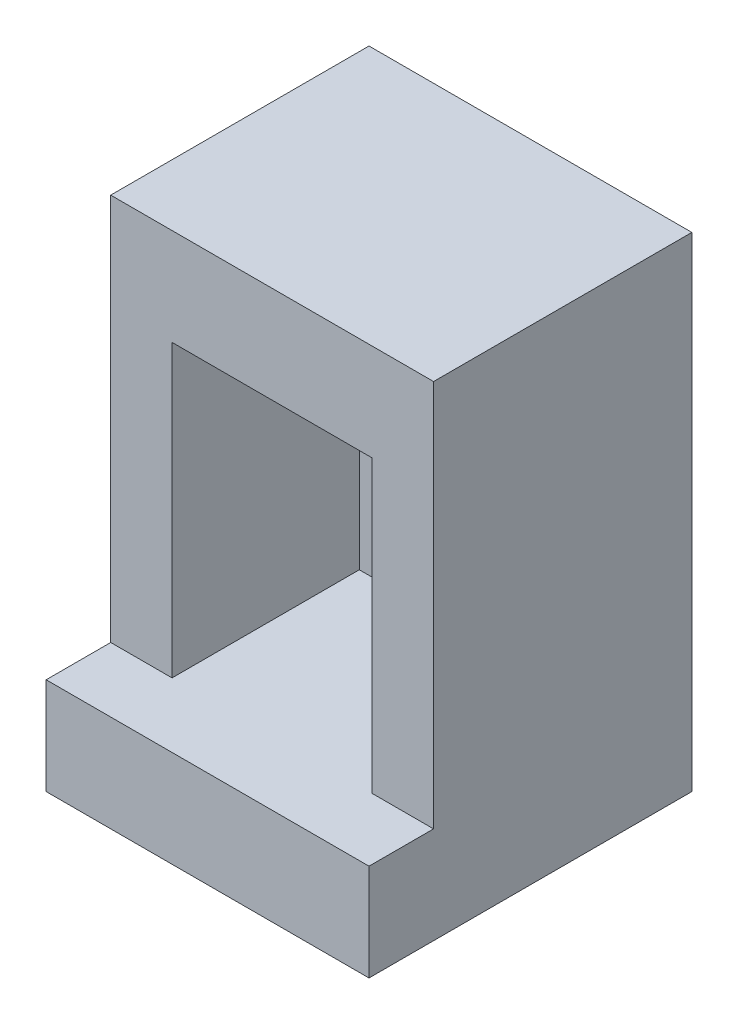
ISO-10303-21;
HEADER;
FILE_DESCRIPTION(('STEP AP214'),'2;1');
FILE_NAME('part.step','',(''),(''),'','','');
FILE_SCHEMA(('AUTOMOTIVE_DESIGN { 1 0 10303 214 1 1 1 1 }'));
ENDSEC;
DATA;
#1=APPLICATION_CONTEXT('core data for automotive mechanical design processes');
#2=APPLICATION_PROTOCOL_DEFINITION('international standard','automotive_design',2000,#1);
#3=PRODUCT_CONTEXT('',#1,'mechanical');
#4=PRODUCT('Part','Part','',(#3));
#5=PRODUCT_RELATED_PRODUCT_CATEGORY('part','',(#4));
#6=PRODUCT_DEFINITION_FORMATION('','',#4);
#7=PRODUCT_DEFINITION_CONTEXT('part definition',#1,'design');
#8=PRODUCT_DEFINITION('design','',#6,#7);
#9=PRODUCT_DEFINITION_SHAPE('','',#8);
#10=(LENGTH_UNIT() NAMED_UNIT(*) SI_UNIT(.MILLI.,.METRE.));
#11=(NAMED_UNIT(*) PLANE_ANGLE_UNIT() SI_UNIT($,.RADIAN.));
#12=(NAMED_UNIT(*) SI_UNIT($,.STERADIAN.) SOLID_ANGLE_UNIT());
#13=UNCERTAINTY_MEASURE_WITH_UNIT(LENGTH_MEASURE(1.E-05),#10,'distance_accuracy_value','');
#14=(GEOMETRIC_REPRESENTATION_CONTEXT(3) GLOBAL_UNCERTAINTY_ASSIGNED_CONTEXT((#13)) GLOBAL_UNIT_ASSIGNED_CONTEXT((#10,
#11,#12)) REPRESENTATION_CONTEXT('',''));
#15=CARTESIAN_POINT('',(0.,0.,0.));
#16=DIRECTION('',(0.,0.,1.));
#17=DIRECTION('',(1.,0.,0.));
#18=AXIS2_PLACEMENT_3D('',#15,#16,#17);
#19=CARTESIAN_POINT('',(0.,3.,0.));
#20=DIRECTION('',(0.,-1.,0.));
#21=DIRECTION('',(0.,0.,-1.));
#22=AXIS2_PLACEMENT_3D('',#19,#20,#21);
#23=PLANE('',#22);
#24=DIRECTION('',(1.,0.,0.));
#25=VECTOR('',#24,1.);
#26=CARTESIAN_POINT('',(0.,3.,-2.));
#27=LINE('',#26,#25);
#28=CARTESIAN_POINT('',(0.,3.,-2.));
#29=VERTEX_POINT('',#28);
#30=CARTESIAN_POINT('',(1.9,3.,-2.));
#31=VERTEX_POINT('',#30);
#32=EDGE_CURVE('E55',#29,#31,#27,.T.);
#33=ORIENTED_EDGE('',*,*,#32,.F.);
#34=DIRECTION('',(0.,0.,1.));
#35=VECTOR('',#34,1.);
#36=CARTESIAN_POINT('',(0.,3.,0.));
#37=LINE('',#36,#35);
#38=CARTESIAN_POINT('',(0.,3.,0.));
#39=VERTEX_POINT('',#38);
#40=EDGE_CURVE('E167',#29,#39,#37,.T.);
#41=ORIENTED_EDGE('',*,*,#40,.T.);
#42=DIRECTION('',(1.,0.,0.));
#43=VECTOR('',#42,1.);
#44=CARTESIAN_POINT('',(0.,3.,0.));
#45=LINE('',#44,#43);
#46=CARTESIAN_POINT('',(10.,3.,0.));
#47=VERTEX_POINT('',#46);
#48=EDGE_CURVE('E169',#39,#47,#45,.T.);
#49=ORIENTED_EDGE('',*,*,#48,.T.);
#50=DIRECTION('',(0.,0.,-1.));
#51=VECTOR('',#50,1.);
#52=CARTESIAN_POINT('',(10.,3.,0.));
#53=LINE('',#52,#51);
#54=CARTESIAN_POINT('',(10.,3.,-2.));
#55=VERTEX_POINT('',#54);
#56=EDGE_CURVE('E172',#47,#55,#53,.T.);
#57=ORIENTED_EDGE('',*,*,#56,.T.);
#58=CARTESIAN_POINT('',(8.1,3.,-2.));
#59=VERTEX_POINT('',#58);
#60=EDGE_CURVE('E144',#59,#55,#27,.T.);
#61=ORIENTED_EDGE('',*,*,#60,.F.);
#62=DIRECTION('',(0.,0.,1.));
#63=VECTOR('',#62,1.);
#64=CARTESIAN_POINT('',(8.1,3.,-7.8));
#65=LINE('',#64,#63);
#66=CARTESIAN_POINT('',(8.1,3.,-7.8));
#67=VERTEX_POINT('',#66);
#68=EDGE_CURVE('E114',#67,#59,#65,.T.);
#69=ORIENTED_EDGE('',*,*,#68,.F.);
#70=DIRECTION('',(1.,0.,0.));
#71=VECTOR('',#70,1.);
#72=CARTESIAN_POINT('',(1.9,3.,-7.8));
#73=LINE('',#72,#71);
#74=CARTESIAN_POINT('',(1.9,3.,-7.8));
#75=VERTEX_POINT('',#74);
#76=EDGE_CURVE('E118',#75,#67,#73,.T.);
#77=ORIENTED_EDGE('',*,*,#76,.F.);
#78=DIRECTION('',(0.,0.,1.));
#79=VECTOR('',#78,1.);
#80=CARTESIAN_POINT('',(1.9,3.,-7.8));
#81=LINE('',#80,#79);
#82=EDGE_CURVE('E108',#75,#31,#81,.T.);
#83=ORIENTED_EDGE('',*,*,#82,.T.);
#84=EDGE_LOOP('',(#33,#41,#49,#57,#61,#69,#77,#83));
#85=FACE_BOUND('',#84,.T.);
#86=ADVANCED_FACE('F33',(#85),#23,.F.);
#87=CARTESIAN_POINT('',(0.,3.,0.));
#88=DIRECTION('',(1.,0.,0.));
#89=DIRECTION('',(0.,0.,-1.));
#90=AXIS2_PLACEMENT_3D('',#87,#88,#89);
#91=PLANE('',#90);
#92=DIRECTION('',(0.,0.,1.));
#93=VECTOR('',#92,1.);
#94=CARTESIAN_POINT('',(0.,0.,0.));
#95=LINE('',#94,#93);
#96=CARTESIAN_POINT('',(0.,0.,-10.));
#97=VERTEX_POINT('',#96);
#98=CARTESIAN_POINT('',(0.,0.,0.));
#99=VERTEX_POINT('',#98);
#100=EDGE_CURVE('E166',#97,#99,#95,.T.);
#101=ORIENTED_EDGE('',*,*,#100,.T.);
#102=DIRECTION('',(0.,-1.,0.));
#103=VECTOR('',#102,1.);
#104=CARTESIAN_POINT('',(0.,3.,0.));
#105=LINE('',#104,#103);
#106=EDGE_CURVE('E11',#39,#99,#105,.T.);
#107=ORIENTED_EDGE('',*,*,#106,.F.);
#108=ORIENTED_EDGE('',*,*,#40,.F.);
#109=DIRECTION('',(0.,-1.,0.));
#110=VECTOR('',#109,1.);
#111=CARTESIAN_POINT('',(0.,15.,-2.));
#112=LINE('',#111,#110);
#113=CARTESIAN_POINT('',(0.,15.,-2.));
#114=VERTEX_POINT('',#113);
#115=EDGE_CURVE('E163',#114,#29,#112,.T.);
#116=ORIENTED_EDGE('',*,*,#115,.F.);
#117=DIRECTION('',(0.,0.,1.));
#118=VECTOR('',#117,1.);
#119=CARTESIAN_POINT('',(0.,15.,-10.));
#120=LINE('',#119,#118);
#121=CARTESIAN_POINT('',(0.,15.,-10.));
#122=VERTEX_POINT('',#121);
#123=EDGE_CURVE('E148',#122,#114,#120,.T.);
#124=ORIENTED_EDGE('',*,*,#123,.F.);
#125=DIRECTION('',(0.,-1.,0.));
#126=VECTOR('',#125,1.);
#127=CARTESIAN_POINT('',(0.,3.,-10.));
#128=LINE('',#127,#126);
#129=EDGE_CURVE('E175',#122,#97,#128,.T.);
#130=ORIENTED_EDGE('',*,*,#129,.T.);
#131=EDGE_LOOP('',(#101,#107,#108,#116,#124,#130));
#132=FACE_BOUND('',#131,.T.);
#133=ADVANCED_FACE('F35',(#132),#91,.F.);
#134=CARTESIAN_POINT('',(0.,3.,0.));
#135=DIRECTION('',(0.,0.,-1.));
#136=DIRECTION('',(-1.,0.,0.));
#137=AXIS2_PLACEMENT_3D('',#134,#135,#136);
#138=PLANE('',#137);
#139=DIRECTION('',(1.,0.,0.));
#140=VECTOR('',#139,1.);
#141=CARTESIAN_POINT('',(0.,0.,0.));
#142=LINE('',#141,#140);
#143=CARTESIAN_POINT('',(10.,0.,0.));
#144=VERTEX_POINT('',#143);
#145=EDGE_CURVE('E178',#99,#144,#142,.T.);
#146=ORIENTED_EDGE('',*,*,#145,.T.);
#147=DIRECTION('',(0.,-1.,0.));
#148=VECTOR('',#147,1.);
#149=CARTESIAN_POINT('',(10.,3.,0.));
#150=LINE('',#149,#148);
#151=EDGE_CURVE('E41',#47,#144,#150,.T.);
#152=ORIENTED_EDGE('',*,*,#151,.F.);
#153=ORIENTED_EDGE('',*,*,#48,.F.);
#154=ORIENTED_EDGE('',*,*,#106,.T.);
#155=EDGE_LOOP('',(#146,#152,#153,#154));
#156=FACE_BOUND('',#155,.T.);
#157=ADVANCED_FACE('F214',(#156),#138,.F.);
#158=CARTESIAN_POINT('',(10.,3.,0.));
#159=DIRECTION('',(-1.,0.,0.));
#160=DIRECTION('',(0.,0.,1.));
#161=AXIS2_PLACEMENT_3D('',#158,#159,#160);
#162=PLANE('',#161);
#163=DIRECTION('',(0.,0.,-1.));
#164=VECTOR('',#163,1.);
#165=CARTESIAN_POINT('',(10.,0.,0.));
#166=LINE('',#165,#164);
#167=CARTESIAN_POINT('',(10.,0.,-10.));
#168=VERTEX_POINT('',#167);
#169=EDGE_CURVE('E180',#144,#168,#166,.T.);
#170=ORIENTED_EDGE('',*,*,#169,.T.);
#171=DIRECTION('',(0.,-1.,0.));
#172=VECTOR('',#171,1.);
#173=CARTESIAN_POINT('',(10.,3.,-10.));
#174=LINE('',#173,#172);
#175=CARTESIAN_POINT('',(10.,15.,-10.));
#176=VERTEX_POINT('',#175);
#177=EDGE_CURVE('E185',#176,#168,#174,.T.);
#178=ORIENTED_EDGE('',*,*,#177,.F.);
#179=DIRECTION('',(0.,0.,-1.));
#180=VECTOR('',#179,1.);
#181=CARTESIAN_POINT('',(10.,15.,-10.));
#182=LINE('',#181,#180);
#183=CARTESIAN_POINT('',(10.,15.,-2.));
#184=VERTEX_POINT('',#183);
#185=EDGE_CURVE('E153',#184,#176,#182,.T.);
#186=ORIENTED_EDGE('',*,*,#185,.F.);
#187=DIRECTION('',(0.,-1.,0.));
#188=VECTOR('',#187,1.);
#189=CARTESIAN_POINT('',(10.,15.,-2.));
#190=LINE('',#189,#188);
#191=EDGE_CURVE('E159',#184,#55,#190,.T.);
#192=ORIENTED_EDGE('',*,*,#191,.T.);
#193=ORIENTED_EDGE('',*,*,#56,.F.);
#194=ORIENTED_EDGE('',*,*,#151,.T.);
#195=EDGE_LOOP('',(#170,#178,#186,#192,#193,#194));
#196=FACE_BOUND('',#195,.T.);
#197=ADVANCED_FACE('F192',(#196),#162,.F.);
#198=CARTESIAN_POINT('',(0.,3.,-10.));
#199=DIRECTION('',(0.,0.,1.));
#200=DIRECTION('',(1.,0.,0.));
#201=AXIS2_PLACEMENT_3D('',#198,#199,#200);
#202=PLANE('',#201);
#203=CARTESIAN_POINT('',(5.,9.3,-10.));
#204=DIRECTION('',(0.,0.,1.));
#205=DIRECTION('',(1.,0.,0.));
#206=AXIS2_PLACEMENT_3D('',#203,#204,#205);
#207=CIRCLE('',#206,0.75);
#208=CARTESIAN_POINT('',(5.75,9.3,-10.));
#209=VERTEX_POINT('',#208);
#210=EDGE_CURVE('E139',#209,#209,#207,.T.);
#211=ORIENTED_EDGE('',*,*,#210,.T.);
#212=EDGE_LOOP('',(#211));
#213=FACE_BOUND('',#212,.T.);
#214=DIRECTION('',(-1.,0.,0.));
#215=VECTOR('',#214,1.);
#216=CARTESIAN_POINT('',(0.,0.,-10.));
#217=LINE('',#216,#215);
#218=EDGE_CURVE('E170',#168,#97,#217,.T.);
#219=ORIENTED_EDGE('',*,*,#218,.T.);
#220=ORIENTED_EDGE('',*,*,#129,.F.);
#221=DIRECTION('',(-1.,0.,0.));
#222=VECTOR('',#221,1.);
#223=CARTESIAN_POINT('',(0.,15.,-10.));
#224=LINE('',#223,#222);
#225=EDGE_CURVE('E156',#176,#122,#224,.T.);
#226=ORIENTED_EDGE('',*,*,#225,.F.);
#227=ORIENTED_EDGE('',*,*,#177,.T.);
#228=EDGE_LOOP('',(#219,#220,#226,#227));
#229=FACE_BOUND('',#228,.T.);
#230=ADVANCED_FACE('F200',(#213,#229),#202,.F.);
#231=CARTESIAN_POINT('',(0.,0.,0.));
#232=DIRECTION('',(0.,-1.,0.));
#233=DIRECTION('',(0.,0.,-1.));
#234=AXIS2_PLACEMENT_3D('',#231,#232,#233);
#235=PLANE('',#234);
#236=ORIENTED_EDGE('',*,*,#100,.F.);
#237=ORIENTED_EDGE('',*,*,#218,.F.);
#238=ORIENTED_EDGE('',*,*,#169,.F.);
#239=ORIENTED_EDGE('',*,*,#145,.F.);
#240=EDGE_LOOP('',(#236,#237,#238,#239));
#241=FACE_BOUND('',#240,.T.);
#242=ADVANCED_FACE('F198',(#241),#235,.T.);
#243=CARTESIAN_POINT('',(0.,15.,-2.));
#244=DIRECTION('',(0.,0.,-1.));
#245=DIRECTION('',(-1.,0.,0.));
#246=AXIS2_PLACEMENT_3D('',#243,#244,#245);
#247=PLANE('',#246);
#248=ORIENTED_EDGE('',*,*,#32,.T.);
#249=DIRECTION('',(0.,-1.,0.));
#250=VECTOR('',#249,1.);
#251=CARTESIAN_POINT('',(1.9,12.,-2.));
#252=LINE('',#251,#250);
#253=CARTESIAN_POINT('',(1.9,12.,-2.));
#254=VERTEX_POINT('',#253);
#255=EDGE_CURVE('E48',#254,#31,#252,.T.);
#256=ORIENTED_EDGE('',*,*,#255,.F.);
#257=DIRECTION('',(-1.,0.,0.));
#258=VECTOR('',#257,1.);
#259=CARTESIAN_POINT('',(1.9,12.,-2.));
#260=LINE('',#259,#258);
#261=CARTESIAN_POINT('',(8.1,12.,-2.));
#262=VERTEX_POINT('',#261);
#263=EDGE_CURVE('E127',#262,#254,#260,.T.);
#264=ORIENTED_EDGE('',*,*,#263,.F.);
#265=DIRECTION('',(0.,1.,0.));
#266=VECTOR('',#265,1.);
#267=CARTESIAN_POINT('',(8.1,12.,-2.));
#268=LINE('',#267,#266);
#269=EDGE_CURVE('E130',#59,#262,#268,.T.);
#270=ORIENTED_EDGE('',*,*,#269,.F.);
#271=ORIENTED_EDGE('',*,*,#60,.T.);
#272=ORIENTED_EDGE('',*,*,#191,.F.);
#273=DIRECTION('',(1.,0.,0.));
#274=VECTOR('',#273,1.);
#275=CARTESIAN_POINT('',(0.,15.,-2.));
#276=LINE('',#275,#274);
#277=EDGE_CURVE('E151',#114,#184,#276,.T.);
#278=ORIENTED_EDGE('',*,*,#277,.F.);
#279=ORIENTED_EDGE('',*,*,#115,.T.);
#280=EDGE_LOOP('',(#248,#256,#264,#270,#271,#272,#278,#279));
#281=FACE_BOUND('',#280,.T.);
#282=ADVANCED_FACE('F211',(#281),#247,.F.);
#283=CARTESIAN_POINT('',(0.,15.,0.));
#284=DIRECTION('',(0.,1.,0.));
#285=DIRECTION('',(0.,0.,1.));
#286=AXIS2_PLACEMENT_3D('',#283,#284,#285);
#287=PLANE('',#286);
#288=ORIENTED_EDGE('',*,*,#123,.T.);
#289=ORIENTED_EDGE('',*,*,#277,.T.);
#290=ORIENTED_EDGE('',*,*,#185,.T.);
#291=ORIENTED_EDGE('',*,*,#225,.T.);
#292=EDGE_LOOP('',(#288,#289,#290,#291));
#293=FACE_BOUND('',#292,.T.);
#294=ADVANCED_FACE('F207',(#293),#287,.T.);
#295=CARTESIAN_POINT('',(1.9,12.,-7.8));
#296=DIRECTION('',(-1.,0.,0.));
#297=DIRECTION('',(0.,-1.,0.));
#298=AXIS2_PLACEMENT_3D('',#295,#296,#297);
#299=PLANE('',#298);
#300=ORIENTED_EDGE('',*,*,#255,.T.);
#301=ORIENTED_EDGE('',*,*,#82,.F.);
#302=DIRECTION('',(0.,-1.,0.));
#303=VECTOR('',#302,1.);
#304=CARTESIAN_POINT('',(1.9,12.,-7.8));
#305=LINE('',#304,#303);
#306=CARTESIAN_POINT('',(1.9,12.,-7.8));
#307=VERTEX_POINT('',#306);
#308=EDGE_CURVE('E112',#307,#75,#305,.T.);
#309=ORIENTED_EDGE('',*,*,#308,.F.);
#310=DIRECTION('',(0.,0.,1.));
#311=VECTOR('',#310,1.);
#312=CARTESIAN_POINT('',(1.9,12.,-7.8));
#313=LINE('',#312,#311);
#314=EDGE_CURVE('E142',#307,#254,#313,.T.);
#315=ORIENTED_EDGE('',*,*,#314,.T.);
#316=EDGE_LOOP('',(#300,#301,#309,#315));
#317=FACE_BOUND('',#316,.T.);
#318=ADVANCED_FACE('F110',(#317),#299,.F.);
#319=CARTESIAN_POINT('',(1.9,12.,-7.8));
#320=DIRECTION('',(0.,1.,0.));
#321=DIRECTION('',(0.,0.,1.));
#322=AXIS2_PLACEMENT_3D('',#319,#320,#321);
#323=PLANE('',#322);
#324=ORIENTED_EDGE('',*,*,#263,.T.);
#325=ORIENTED_EDGE('',*,*,#314,.F.);
#326=DIRECTION('',(-1.,0.,0.));
#327=VECTOR('',#326,1.);
#328=CARTESIAN_POINT('',(1.9,12.,-7.8));
#329=LINE('',#328,#327);
#330=CARTESIAN_POINT('',(8.1,12.,-7.8));
#331=VERTEX_POINT('',#330);
#332=EDGE_CURVE('E115',#331,#307,#329,.T.);
#333=ORIENTED_EDGE('',*,*,#332,.F.);
#334=DIRECTION('',(0.,0.,1.));
#335=VECTOR('',#334,1.);
#336=CARTESIAN_POINT('',(8.1,12.,-7.8));
#337=LINE('',#336,#335);
#338=EDGE_CURVE('E145',#331,#262,#337,.T.);
#339=ORIENTED_EDGE('',*,*,#338,.T.);
#340=EDGE_LOOP('',(#324,#325,#333,#339));
#341=FACE_BOUND('',#340,.T.);
#342=ADVANCED_FACE('F216',(#341),#323,.F.);
#343=CARTESIAN_POINT('',(8.1,12.,-7.8));
#344=DIRECTION('',(1.,0.,0.));
#345=DIRECTION('',(0.,1.,0.));
#346=AXIS2_PLACEMENT_3D('',#343,#344,#345);
#347=PLANE('',#346);
#348=ORIENTED_EDGE('',*,*,#269,.T.);
#349=ORIENTED_EDGE('',*,*,#338,.F.);
#350=DIRECTION('',(0.,1.,0.));
#351=VECTOR('',#350,1.);
#352=CARTESIAN_POINT('',(8.1,12.,-7.8));
#353=LINE('',#352,#351);
#354=EDGE_CURVE('E123',#67,#331,#353,.T.);
#355=ORIENTED_EDGE('',*,*,#354,.F.);
#356=ORIENTED_EDGE('',*,*,#68,.T.);
#357=EDGE_LOOP('',(#348,#349,#355,#356));
#358=FACE_BOUND('',#357,.T.);
#359=ADVANCED_FACE('F218',(#358),#347,.F.);
#360=CARTESIAN_POINT('',(0.,0.,-7.8));
#361=DIRECTION('',(0.,0.,1.));
#362=DIRECTION('',(1.,0.,0.));
#363=AXIS2_PLACEMENT_3D('',#360,#361,#362);
#364=PLANE('',#363);
#365=CARTESIAN_POINT('',(5.,9.3,-7.8));
#366=DIRECTION('',(0.,0.,1.));
#367=DIRECTION('',(1.,0.,0.));
#368=AXIS2_PLACEMENT_3D('',#365,#366,#367);
#369=CIRCLE('',#368,0.75);
#370=CARTESIAN_POINT('',(5.75,9.3,-7.8));
#371=VERTEX_POINT('',#370);
#372=EDGE_CURVE('E133',#371,#371,#369,.T.);
#373=ORIENTED_EDGE('',*,*,#372,.F.);
#374=EDGE_LOOP('',(#373));
#375=FACE_BOUND('',#374,.T.);
#376=ORIENTED_EDGE('',*,*,#308,.T.);
#377=ORIENTED_EDGE('',*,*,#76,.T.);
#378=ORIENTED_EDGE('',*,*,#354,.T.);
#379=ORIENTED_EDGE('',*,*,#332,.T.);
#380=EDGE_LOOP('',(#376,#377,#378,#379));
#381=FACE_BOUND('',#380,.T.);
#382=ADVANCED_FACE('F125',(#375,#381),#364,.T.);
#383=CARTESIAN_POINT('',(5.,9.3,-10.));
#384=DIRECTION('',(0.,0.,1.));
#385=DIRECTION('',(1.,0.,0.));
#386=AXIS2_PLACEMENT_3D('',#383,#384,#385);
#387=CYLINDRICAL_SURFACE('',#386,0.75);
#388=ORIENTED_EDGE('',*,*,#210,.F.);
#389=EDGE_LOOP('',(#388));
#390=FACE_BOUND('',#389,.T.);
#391=ORIENTED_EDGE('',*,*,#372,.T.);
#392=EDGE_LOOP('',(#391));
#393=FACE_BOUND('',#392,.T.);
#394=ADVANCED_FACE('F226',(#390,#393),#387,.F.);
#395=CLOSED_SHELL('',(#86,#133,#157,#197,#230,#242,#282,#294,#318,#342,#359,#382,#394));
#396=MANIFOLD_SOLID_BREP('B2',#395);
#397=ADVANCED_BREP_SHAPE_REPRESENTATION('',(#18,#396),#14);
#398=SHAPE_DEFINITION_REPRESENTATION(#9,#397);
ENDSEC;
END-ISO-10303-21;
